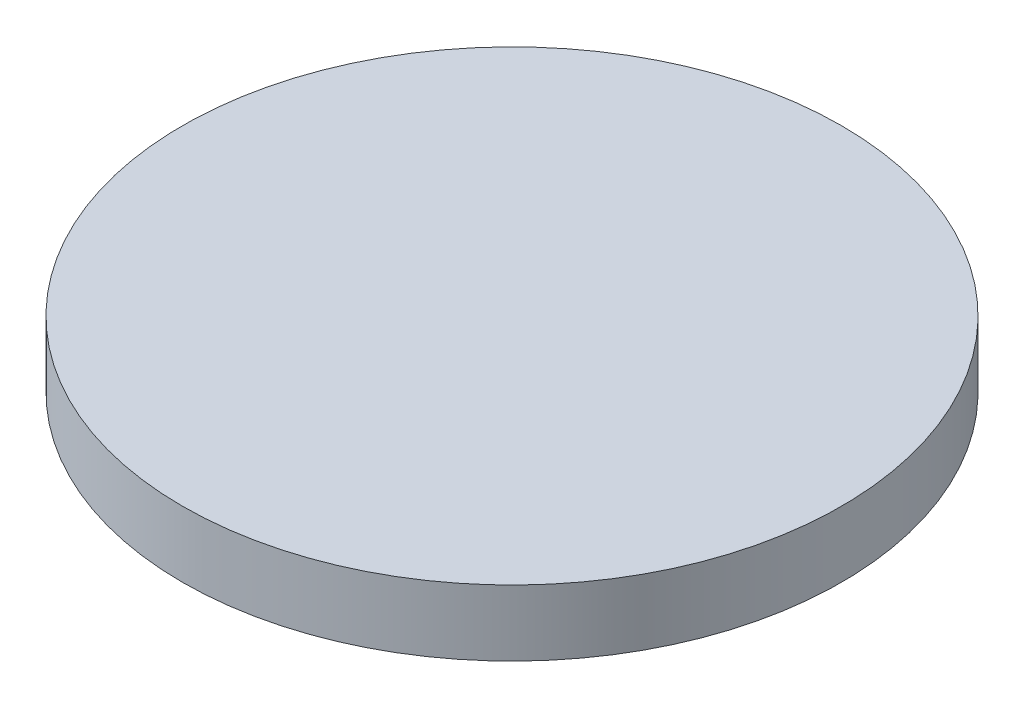
ISO-10303-21;
HEADER;
FILE_DESCRIPTION(('STEP AP214'),'2;1');
FILE_NAME('part.step','',(''),(''),'','','');
FILE_SCHEMA(('AUTOMOTIVE_DESIGN { 1 0 10303 214 1 1 1 1 }'));
ENDSEC;
DATA;
#1=APPLICATION_CONTEXT('core data for automotive mechanical design processes');
#2=APPLICATION_PROTOCOL_DEFINITION('international standard','automotive_design',2000,#1);
#3=PRODUCT_CONTEXT('',#1,'mechanical');
#4=PRODUCT('Part','Part','',(#3));
#5=PRODUCT_RELATED_PRODUCT_CATEGORY('part','',(#4));
#6=PRODUCT_DEFINITION_FORMATION('','',#4);
#7=PRODUCT_DEFINITION_CONTEXT('part definition',#1,'design');
#8=PRODUCT_DEFINITION('design','',#6,#7);
#9=PRODUCT_DEFINITION_SHAPE('','',#8);
#10=(LENGTH_UNIT() NAMED_UNIT(*) SI_UNIT(.MILLI.,.METRE.));
#11=(NAMED_UNIT(*) PLANE_ANGLE_UNIT() SI_UNIT($,.RADIAN.));
#12=(NAMED_UNIT(*) SI_UNIT($,.STERADIAN.) SOLID_ANGLE_UNIT());
#13=UNCERTAINTY_MEASURE_WITH_UNIT(LENGTH_MEASURE(1.E-05),#10,'distance_accuracy_value','');
#14=(GEOMETRIC_REPRESENTATION_CONTEXT(3) GLOBAL_UNCERTAINTY_ASSIGNED_CONTEXT((#13)) GLOBAL_UNIT_ASSIGNED_CONTEXT((#10,
#11,#12)) REPRESENTATION_CONTEXT('',''));
#15=CARTESIAN_POINT('',(0.,0.,0.));
#16=DIRECTION('',(0.,0.,1.));
#17=DIRECTION('',(1.,0.,0.));
#18=AXIS2_PLACEMENT_3D('',#15,#16,#17);
#19=CARTESIAN_POINT('',(0.,-0.5,0.));
#20=DIRECTION('',(0.,1.,0.));
#21=DIRECTION('',(0.,0.,1.));
#22=AXIS2_PLACEMENT_3D('',#19,#20,#21);
#23=CYLINDRICAL_SURFACE('',#22,2.5);
#24=CARTESIAN_POINT('',(0.,-0.5,0.));
#25=DIRECTION('',(0.,1.,0.));
#26=DIRECTION('',(0.,0.,1.));
#27=AXIS2_PLACEMENT_3D('',#24,#25,#26);
#28=CIRCLE('',#27,2.5);
#29=CARTESIAN_POINT('',(0.,-0.5,2.5));
#30=VERTEX_POINT('',#29);
#31=EDGE_CURVE('E10',#30,#30,#28,.T.);
#32=ORIENTED_EDGE('',*,*,#31,.T.);
#33=EDGE_LOOP('',(#32));
#34=FACE_BOUND('',#33,.T.);
#35=CARTESIAN_POINT('',(0.,0.,0.));
#36=DIRECTION('',(0.,1.,0.));
#37=DIRECTION('',(0.,0.,1.));
#38=AXIS2_PLACEMENT_3D('',#35,#36,#37);
#39=CIRCLE('',#38,2.5);
#40=CARTESIAN_POINT('',(0.,0.,2.5));
#41=VERTEX_POINT('',#40);
#42=EDGE_CURVE('E34',#41,#41,#39,.T.);
#43=ORIENTED_EDGE('',*,*,#42,.F.);
#44=EDGE_LOOP('',(#43));
#45=FACE_BOUND('',#44,.T.);
#46=ADVANCED_FACE('F31',(#34,#45),#23,.T.);
#47=CARTESIAN_POINT('',(0.,-0.5,0.));
#48=DIRECTION('',(0.,1.,0.));
#49=DIRECTION('',(0.,0.,1.));
#50=AXIS2_PLACEMENT_3D('',#47,#48,#49);
#51=PLANE('',#50);
#52=ORIENTED_EDGE('',*,*,#31,.F.);
#53=EDGE_LOOP('',(#52));
#54=FACE_BOUND('',#53,.T.);
#55=ADVANCED_FACE('F46',(#54),#51,.F.);
#56=CARTESIAN_POINT('',(0.,0.,0.));
#57=DIRECTION('',(0.,1.,0.));
#58=DIRECTION('',(0.,0.,1.));
#59=AXIS2_PLACEMENT_3D('',#56,#57,#58);
#60=PLANE('',#59);
#61=ORIENTED_EDGE('',*,*,#42,.T.);
#62=EDGE_LOOP('',(#61));
#63=FACE_BOUND('',#62,.T.);
#64=ADVANCED_FACE('F43',(#63),#60,.T.);
#65=CLOSED_SHELL('',(#46,#55,#64));
#66=MANIFOLD_SOLID_BREP('B2',#65);
#67=ADVANCED_BREP_SHAPE_REPRESENTATION('',(#18,#66),#14);
#68=SHAPE_DEFINITION_REPRESENTATION(#9,#67);
ENDSEC;
END-ISO-10303-21;
